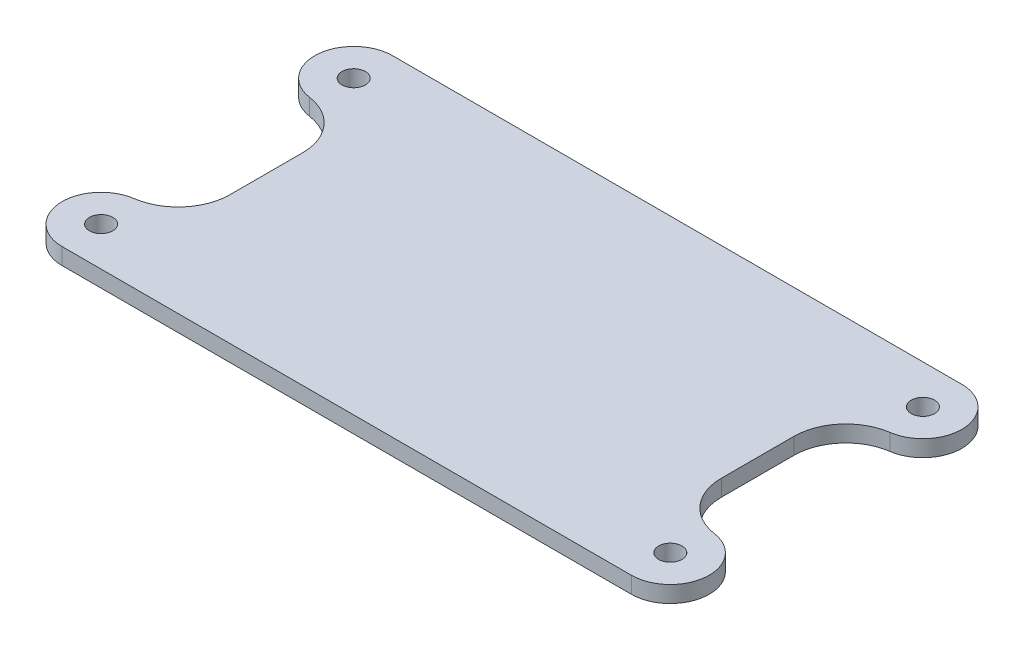
ISO-10303-21;
HEADER;
FILE_DESCRIPTION(('STEP AP214'),'2;1');
FILE_NAME('part.step','',(''),(''),'','','');
FILE_SCHEMA(('AUTOMOTIVE_DESIGN { 1 0 10303 214 1 1 1 1 }'));
ENDSEC;
DATA;
#1=APPLICATION_CONTEXT('core data for automotive mechanical design processes');
#2=APPLICATION_PROTOCOL_DEFINITION('international standard','automotive_design',2000,#1);
#3=PRODUCT_CONTEXT('',#1,'mechanical');
#4=PRODUCT('Part','Part','',(#3));
#5=PRODUCT_RELATED_PRODUCT_CATEGORY('part','',(#4));
#6=PRODUCT_DEFINITION_FORMATION('','',#4);
#7=PRODUCT_DEFINITION_CONTEXT('part definition',#1,'design');
#8=PRODUCT_DEFINITION('design','',#6,#7);
#9=PRODUCT_DEFINITION_SHAPE('','',#8);
#10=(LENGTH_UNIT() NAMED_UNIT(*) SI_UNIT(.MILLI.,.METRE.));
#11=(NAMED_UNIT(*) PLANE_ANGLE_UNIT() SI_UNIT($,.RADIAN.));
#12=(NAMED_UNIT(*) SI_UNIT($,.STERADIAN.) SOLID_ANGLE_UNIT());
#13=UNCERTAINTY_MEASURE_WITH_UNIT(LENGTH_MEASURE(1.E-05),#10,'distance_accuracy_value','');
#14=(GEOMETRIC_REPRESENTATION_CONTEXT(3) GLOBAL_UNCERTAINTY_ASSIGNED_CONTEXT((#13)) GLOBAL_UNIT_ASSIGNED_CONTEXT((#10,
#11,#12)) REPRESENTATION_CONTEXT('',''));
#15=CARTESIAN_POINT('',(0.,0.,0.));
#16=DIRECTION('',(0.,0.,1.));
#17=DIRECTION('',(1.,0.,0.));
#18=AXIS2_PLACEMENT_3D('',#15,#16,#17);
#19=CARTESIAN_POINT('',(-54.75,1.5875,-24.297));
#20=DIRECTION('',(0.,1.,0.));
#21=DIRECTION('',(0.,0.,1.));
#22=AXIS2_PLACEMENT_3D('',#19,#20,#21);
#23=PLANE('',#22);
#24=CARTESIAN_POINT('',(-54.75,1.5875,24.297));
#25=DIRECTION('',(0.,1.,0.));
#26=DIRECTION('',(0.,0.,1.));
#27=AXIS2_PLACEMENT_3D('',#24,#25,#26);
#28=CIRCLE('',#27,2.2479);
#29=CARTESIAN_POINT('',(-54.75,1.5875,26.5449));
#30=VERTEX_POINT('',#29);
#31=EDGE_CURVE('E444',#30,#30,#28,.T.);
#32=ORIENTED_EDGE('',*,*,#31,.F.);
#33=EDGE_LOOP('',(#32));
#34=FACE_BOUND('',#33,.T.);
#35=CARTESIAN_POINT('',(54.75,1.5875,-24.297));
#36=DIRECTION('',(0.,1.,0.));
#37=DIRECTION('',(0.,0.,1.));
#38=AXIS2_PLACEMENT_3D('',#35,#36,#37);
#39=CIRCLE('',#38,2.2479);
#40=CARTESIAN_POINT('',(54.75,1.5875,-22.0491));
#41=VERTEX_POINT('',#40);
#42=EDGE_CURVE('E166',#41,#41,#39,.T.);
#43=ORIENTED_EDGE('',*,*,#42,.F.);
#44=EDGE_LOOP('',(#43));
#45=FACE_BOUND('',#44,.T.);
#46=CARTESIAN_POINT('',(-54.75,1.5875,-24.297));
#47=DIRECTION('',(0.,1.,0.));
#48=DIRECTION('',(0.,0.,1.));
#49=AXIS2_PLACEMENT_3D('',#46,#47,#48);
#50=CIRCLE('',#49,7.5);
#51=CARTESIAN_POINT('',(-54.75,1.5875,-31.797));
#52=VERTEX_POINT('',#51);
#53=CARTESIAN_POINT('',(-55.8214285714286,1.5875,-16.8739251104191));
#54=VERTEX_POINT('',#53);
#55=EDGE_CURVE('E113',#52,#54,#50,.T.);
#56=ORIENTED_EDGE('',*,*,#55,.T.);
#57=CARTESIAN_POINT('',(-57.25,1.5875,-6.97649192431122));
#58=DIRECTION('',(0.,-1.,0.));
#59=DIRECTION('',(0.,0.,1.));
#60=AXIS2_PLACEMENT_3D('',#57,#58,#59);
#61=CIRCLE('',#60,10.);
#62=CARTESIAN_POINT('',(-47.25,1.5875,-6.97649192431122));
#63=VERTEX_POINT('',#62);
#64=EDGE_CURVE('E256',#54,#63,#61,.T.);
#65=ORIENTED_EDGE('',*,*,#64,.T.);
#66=DIRECTION('',(0.,0.,1.));
#67=VECTOR('',#66,1.);
#68=CARTESIAN_POINT('',(-47.25,1.5875,-6.97649192431122));
#69=LINE('',#68,#67);
#70=CARTESIAN_POINT('',(-47.25,1.5875,6.97649192431122));
#71=VERTEX_POINT('',#70);
#72=EDGE_CURVE('E216',#63,#71,#69,.T.);
#73=ORIENTED_EDGE('',*,*,#72,.T.);
#74=CARTESIAN_POINT('',(-57.25,1.5875,6.97649192431122));
#75=DIRECTION('',(0.,-1.,0.));
#76=DIRECTION('',(0.,0.,1.));
#77=AXIS2_PLACEMENT_3D('',#74,#75,#76);
#78=CIRCLE('',#77,10.);
#79=CARTESIAN_POINT('',(-55.8214285714286,1.5875,16.8739251104191));
#80=VERTEX_POINT('',#79);
#81=EDGE_CURVE('E234',#71,#80,#78,.T.);
#82=ORIENTED_EDGE('',*,*,#81,.T.);
#83=CARTESIAN_POINT('',(-54.75,1.5875,24.297));
#84=DIRECTION('',(0.,1.,0.));
#85=DIRECTION('',(0.,0.,1.));
#86=AXIS2_PLACEMENT_3D('',#83,#84,#85);
#87=CIRCLE('',#86,7.5);
#88=CARTESIAN_POINT('',(-54.75,1.5875,31.797));
#89=VERTEX_POINT('',#88);
#90=EDGE_CURVE('E231',#80,#89,#87,.T.);
#91=ORIENTED_EDGE('',*,*,#90,.T.);
#92=DIRECTION('',(1.,0.,0.));
#93=VECTOR('',#92,1.);
#94=CARTESIAN_POINT('',(-54.75,1.5875,31.797));
#95=LINE('',#94,#93);
#96=CARTESIAN_POINT('',(54.75,1.5875,31.797));
#97=VERTEX_POINT('',#96);
#98=EDGE_CURVE('E233',#89,#97,#95,.T.);
#99=ORIENTED_EDGE('',*,*,#98,.T.);
#100=CARTESIAN_POINT('',(54.75,1.5875,24.297));
#101=DIRECTION('',(0.,1.,0.));
#102=DIRECTION('',(0.,0.,1.));
#103=AXIS2_PLACEMENT_3D('',#100,#101,#102);
#104=CIRCLE('',#103,7.5);
#105=CARTESIAN_POINT('',(55.8214285714286,1.5875,16.8739251104191));
#106=VERTEX_POINT('',#105);
#107=EDGE_CURVE('E236',#97,#106,#104,.T.);
#108=ORIENTED_EDGE('',*,*,#107,.T.);
#109=CARTESIAN_POINT('',(57.25,1.5875,6.97649192431123));
#110=DIRECTION('',(0.,-1.,0.));
#111=DIRECTION('',(0.,0.,1.));
#112=AXIS2_PLACEMENT_3D('',#109,#110,#111);
#113=CIRCLE('',#112,10.);
#114=CARTESIAN_POINT('',(47.25,1.5875,6.97649192431123));
#115=VERTEX_POINT('',#114);
#116=EDGE_CURVE('E242',#106,#115,#113,.T.);
#117=ORIENTED_EDGE('',*,*,#116,.T.);
#118=DIRECTION('',(0.,0.,-1.));
#119=VECTOR('',#118,1.);
#120=CARTESIAN_POINT('',(47.25,1.5875,6.97649192431123));
#121=LINE('',#120,#119);
#122=CARTESIAN_POINT('',(47.25,1.5875,-6.97649192431123));
#123=VERTEX_POINT('',#122);
#124=EDGE_CURVE('E145',#115,#123,#121,.T.);
#125=ORIENTED_EDGE('',*,*,#124,.T.);
#126=CARTESIAN_POINT('',(57.25,1.5875,-6.97649192431123));
#127=DIRECTION('',(0.,-1.,0.));
#128=DIRECTION('',(0.,0.,1.));
#129=AXIS2_PLACEMENT_3D('',#126,#127,#128);
#130=CIRCLE('',#129,10.);
#131=CARTESIAN_POINT('',(55.8214285714286,1.5875,-16.8739251104191));
#132=VERTEX_POINT('',#131);
#133=EDGE_CURVE('E139',#123,#132,#130,.T.);
#134=ORIENTED_EDGE('',*,*,#133,.T.);
#135=CARTESIAN_POINT('',(54.75,1.5875,-24.297));
#136=DIRECTION('',(0.,1.,0.));
#137=DIRECTION('',(0.,0.,1.));
#138=AXIS2_PLACEMENT_3D('',#135,#136,#137);
#139=CIRCLE('',#138,7.5);
#140=CARTESIAN_POINT('',(54.75,1.5875,-31.797));
#141=VERTEX_POINT('',#140);
#142=EDGE_CURVE('E143',#132,#141,#139,.T.);
#143=ORIENTED_EDGE('',*,*,#142,.T.);
#144=DIRECTION('',(-1.,0.,0.));
#145=VECTOR('',#144,1.);
#146=CARTESIAN_POINT('',(54.75,1.5875,-31.797));
#147=LINE('',#146,#145);
#148=EDGE_CURVE('E60',#141,#52,#147,.T.);
#149=ORIENTED_EDGE('',*,*,#148,.T.);
#150=EDGE_LOOP('',(#56,#65,#73,#82,#91,#99,#108,#117,#125,#134,#143,#149));
#151=FACE_BOUND('',#150,.T.);
#152=CARTESIAN_POINT('',(54.75,1.5875,24.297));
#153=DIRECTION('',(0.,1.,0.));
#154=DIRECTION('',(0.,0.,1.));
#155=AXIS2_PLACEMENT_3D('',#152,#153,#154);
#156=CIRCLE('',#155,2.2479);
#157=CARTESIAN_POINT('',(54.75,1.5875,26.5449));
#158=VERTEX_POINT('',#157);
#159=EDGE_CURVE('E450',#158,#158,#156,.T.);
#160=ORIENTED_EDGE('',*,*,#159,.F.);
#161=EDGE_LOOP('',(#160));
#162=FACE_BOUND('',#161,.T.);
#163=CARTESIAN_POINT('',(-54.75,1.5875,-24.297));
#164=DIRECTION('',(0.,1.,0.));
#165=DIRECTION('',(0.,0.,1.));
#166=AXIS2_PLACEMENT_3D('',#163,#164,#165);
#167=CIRCLE('',#166,2.2479);
#168=CARTESIAN_POINT('',(-54.75,1.5875,-22.0491));
#169=VERTEX_POINT('',#168);
#170=EDGE_CURVE('E435',#169,#169,#167,.T.);
#171=ORIENTED_EDGE('',*,*,#170,.F.);
#172=EDGE_LOOP('',(#171));
#173=FACE_BOUND('',#172,.T.);
#174=ADVANCED_FACE('F43',(#34,#45,#151,#162,#173),#23,.T.);
#175=CARTESIAN_POINT('',(-54.75,-1.5875,-24.297));
#176=DIRECTION('',(0.,1.,0.));
#177=DIRECTION('',(0.,0.,1.));
#178=AXIS2_PLACEMENT_3D('',#175,#176,#177);
#179=PLANE('',#178);
#180=CARTESIAN_POINT('',(-54.75,-1.5875,-24.297));
#181=DIRECTION('',(0.,1.,0.));
#182=DIRECTION('',(0.,0.,1.));
#183=AXIS2_PLACEMENT_3D('',#180,#181,#182);
#184=CIRCLE('',#183,7.5);
#185=CARTESIAN_POINT('',(-54.75,-1.5875,-31.797));
#186=VERTEX_POINT('',#185);
#187=CARTESIAN_POINT('',(-55.8214285714286,-1.5875,-16.8739251104191));
#188=VERTEX_POINT('',#187);
#189=EDGE_CURVE('E107',#186,#188,#184,.T.);
#190=ORIENTED_EDGE('',*,*,#189,.F.);
#191=DIRECTION('',(-1.,0.,0.));
#192=VECTOR('',#191,1.);
#193=CARTESIAN_POINT('',(54.75,-1.5875,-31.797));
#194=LINE('',#193,#192);
#195=CARTESIAN_POINT('',(54.75,-1.5875,-31.797));
#196=VERTEX_POINT('',#195);
#197=EDGE_CURVE('E186',#196,#186,#194,.T.);
#198=ORIENTED_EDGE('',*,*,#197,.F.);
#199=CARTESIAN_POINT('',(54.75,-1.5875,-24.297));
#200=DIRECTION('',(0.,1.,0.));
#201=DIRECTION('',(0.,0.,1.));
#202=AXIS2_PLACEMENT_3D('',#199,#200,#201);
#203=CIRCLE('',#202,7.5);
#204=CARTESIAN_POINT('',(55.8214285714286,-1.5875,-16.8739251104191));
#205=VERTEX_POINT('',#204);
#206=EDGE_CURVE('E100',#205,#196,#203,.T.);
#207=ORIENTED_EDGE('',*,*,#206,.F.);
#208=CARTESIAN_POINT('',(57.25,-1.5875,-6.97649192431123));
#209=DIRECTION('',(0.,-1.,0.));
#210=DIRECTION('',(0.,0.,1.));
#211=AXIS2_PLACEMENT_3D('',#208,#209,#210);
#212=CIRCLE('',#211,10.);
#213=CARTESIAN_POINT('',(47.25,-1.5875,-6.97649192431123));
#214=VERTEX_POINT('',#213);
#215=EDGE_CURVE('E154',#214,#205,#212,.T.);
#216=ORIENTED_EDGE('',*,*,#215,.F.);
#217=DIRECTION('',(0.,0.,-1.));
#218=VECTOR('',#217,1.);
#219=CARTESIAN_POINT('',(47.25,-1.5875,6.97649192431123));
#220=LINE('',#219,#218);
#221=CARTESIAN_POINT('',(47.25,-1.5875,6.97649192431123));
#222=VERTEX_POINT('',#221);
#223=EDGE_CURVE('E182',#222,#214,#220,.T.);
#224=ORIENTED_EDGE('',*,*,#223,.F.);
#225=CARTESIAN_POINT('',(57.25,-1.5875,6.97649192431123));
#226=DIRECTION('',(0.,-1.,0.));
#227=DIRECTION('',(0.,0.,1.));
#228=AXIS2_PLACEMENT_3D('',#225,#226,#227);
#229=CIRCLE('',#228,10.);
#230=CARTESIAN_POINT('',(55.8214285714286,-1.5875,16.8739251104191));
#231=VERTEX_POINT('',#230);
#232=EDGE_CURVE('E180',#231,#222,#229,.T.);
#233=ORIENTED_EDGE('',*,*,#232,.F.);
#234=CARTESIAN_POINT('',(54.75,-1.5875,24.297));
#235=DIRECTION('',(0.,1.,0.));
#236=DIRECTION('',(0.,0.,1.));
#237=AXIS2_PLACEMENT_3D('',#234,#235,#236);
#238=CIRCLE('',#237,7.5);
#239=CARTESIAN_POINT('',(54.75,-1.5875,31.797));
#240=VERTEX_POINT('',#239);
#241=EDGE_CURVE('E178',#240,#231,#238,.T.);
#242=ORIENTED_EDGE('',*,*,#241,.F.);
#243=DIRECTION('',(1.,0.,0.));
#244=VECTOR('',#243,1.);
#245=CARTESIAN_POINT('',(-54.75,-1.5875,31.797));
#246=LINE('',#245,#244);
#247=CARTESIAN_POINT('',(-54.75,-1.5875,31.797));
#248=VERTEX_POINT('',#247);
#249=EDGE_CURVE('E175',#248,#240,#246,.T.);
#250=ORIENTED_EDGE('',*,*,#249,.F.);
#251=CARTESIAN_POINT('',(-54.75,-1.5875,24.297));
#252=DIRECTION('',(0.,1.,0.));
#253=DIRECTION('',(0.,0.,1.));
#254=AXIS2_PLACEMENT_3D('',#251,#252,#253);
#255=CIRCLE('',#254,7.5);
#256=CARTESIAN_POINT('',(-55.8214285714286,-1.5875,16.8739251104191));
#257=VERTEX_POINT('',#256);
#258=EDGE_CURVE('E173',#257,#248,#255,.T.);
#259=ORIENTED_EDGE('',*,*,#258,.F.);
#260=CARTESIAN_POINT('',(-57.25,-1.5875,6.97649192431122));
#261=DIRECTION('',(0.,-1.,0.));
#262=DIRECTION('',(0.,0.,1.));
#263=AXIS2_PLACEMENT_3D('',#260,#261,#262);
#264=CIRCLE('',#263,10.);
#265=CARTESIAN_POINT('',(-47.25,-1.5875,6.97649192431122));
#266=VERTEX_POINT('',#265);
#267=EDGE_CURVE('E170',#266,#257,#264,.T.);
#268=ORIENTED_EDGE('',*,*,#267,.F.);
#269=DIRECTION('',(0.,0.,1.));
#270=VECTOR('',#269,1.);
#271=CARTESIAN_POINT('',(-47.25,-1.5875,-6.97649192431122));
#272=LINE('',#271,#270);
#273=CARTESIAN_POINT('',(-47.25,-1.5875,-6.97649192431122));
#274=VERTEX_POINT('',#273);
#275=EDGE_CURVE('E168',#274,#266,#272,.T.);
#276=ORIENTED_EDGE('',*,*,#275,.F.);
#277=CARTESIAN_POINT('',(-57.25,-1.5875,-6.97649192431122));
#278=DIRECTION('',(0.,-1.,0.));
#279=DIRECTION('',(0.,0.,1.));
#280=AXIS2_PLACEMENT_3D('',#277,#278,#279);
#281=CIRCLE('',#280,10.);
#282=EDGE_CURVE('E165',#188,#274,#281,.T.);
#283=ORIENTED_EDGE('',*,*,#282,.F.);
#284=EDGE_LOOP('',(#190,#198,#207,#216,#224,#233,#242,#250,#259,#268,#276,#283));
#285=FACE_BOUND('',#284,.T.);
#286=CARTESIAN_POINT('',(54.75,-1.5875,-24.297));
#287=DIRECTION('',(0.,1.,0.));
#288=DIRECTION('',(0.,0.,1.));
#289=AXIS2_PLACEMENT_3D('',#286,#287,#288);
#290=CIRCLE('',#289,2.2479);
#291=CARTESIAN_POINT('',(54.75,-1.5875,-22.0491));
#292=VERTEX_POINT('',#291);
#293=EDGE_CURVE('E260',#292,#292,#290,.T.);
#294=ORIENTED_EDGE('',*,*,#293,.T.);
#295=EDGE_LOOP('',(#294));
#296=FACE_BOUND('',#295,.T.);
#297=CARTESIAN_POINT('',(54.75,-1.5875,24.297));
#298=DIRECTION('',(0.,1.,0.));
#299=DIRECTION('',(0.,0.,1.));
#300=AXIS2_PLACEMENT_3D('',#297,#298,#299);
#301=CIRCLE('',#300,2.2479);
#302=CARTESIAN_POINT('',(54.75,-1.5875,26.5449));
#303=VERTEX_POINT('',#302);
#304=EDGE_CURVE('E447',#303,#303,#301,.T.);
#305=ORIENTED_EDGE('',*,*,#304,.T.);
#306=EDGE_LOOP('',(#305));
#307=FACE_BOUND('',#306,.T.);
#308=CARTESIAN_POINT('',(-54.75,-1.5875,24.297));
#309=DIRECTION('',(0.,1.,0.));
#310=DIRECTION('',(0.,0.,1.));
#311=AXIS2_PLACEMENT_3D('',#308,#309,#310);
#312=CIRCLE('',#311,2.2479);
#313=CARTESIAN_POINT('',(-54.75,-1.5875,26.5449));
#314=VERTEX_POINT('',#313);
#315=EDGE_CURVE('E441',#314,#314,#312,.T.);
#316=ORIENTED_EDGE('',*,*,#315,.T.);
#317=EDGE_LOOP('',(#316));
#318=FACE_BOUND('',#317,.T.);
#319=CARTESIAN_POINT('',(-54.75,-1.5875,-24.297));
#320=DIRECTION('',(0.,1.,0.));
#321=DIRECTION('',(0.,0.,1.));
#322=AXIS2_PLACEMENT_3D('',#319,#320,#321);
#323=CIRCLE('',#322,2.2479);
#324=CARTESIAN_POINT('',(-54.75,-1.5875,-22.0491));
#325=VERTEX_POINT('',#324);
#326=EDGE_CURVE('E438',#325,#325,#323,.T.);
#327=ORIENTED_EDGE('',*,*,#326,.T.);
#328=EDGE_LOOP('',(#327));
#329=FACE_BOUND('',#328,.T.);
#330=ADVANCED_FACE('F220',(#285,#296,#307,#318,#329),#179,.F.);
#331=CARTESIAN_POINT('',(-54.75,1.5875,-24.297));
#332=DIRECTION('',(0.,-1.,0.));
#333=DIRECTION('',(0.,0.,-1.));
#334=AXIS2_PLACEMENT_3D('',#331,#332,#333);
#335=CYLINDRICAL_SURFACE('',#334,7.5);
#336=ORIENTED_EDGE('',*,*,#189,.T.);
#337=DIRECTION('',(0.,-1.,0.));
#338=VECTOR('',#337,1.);
#339=CARTESIAN_POINT('',(-55.8214285714286,1.5875,-16.8739251104191));
#340=LINE('',#339,#338);
#341=EDGE_CURVE('E11',#54,#188,#340,.T.);
#342=ORIENTED_EDGE('',*,*,#341,.F.);
#343=ORIENTED_EDGE('',*,*,#55,.F.);
#344=DIRECTION('',(0.,-1.,0.));
#345=VECTOR('',#344,1.);
#346=CARTESIAN_POINT('',(-54.75,1.5875,-31.797));
#347=LINE('',#346,#345);
#348=EDGE_CURVE('E160',#52,#186,#347,.T.);
#349=ORIENTED_EDGE('',*,*,#348,.T.);
#350=EDGE_LOOP('',(#336,#342,#343,#349));
#351=FACE_BOUND('',#350,.T.);
#352=ADVANCED_FACE('F45',(#351),#335,.T.);
#353=CARTESIAN_POINT('',(-57.25,1.5875,-6.97649192431122));
#354=DIRECTION('',(0.,-1.,0.));
#355=DIRECTION('',(0.,0.,-1.));
#356=AXIS2_PLACEMENT_3D('',#353,#354,#355);
#357=CYLINDRICAL_SURFACE('',#356,10.);
#358=ORIENTED_EDGE('',*,*,#282,.T.);
#359=DIRECTION('',(0.,-1.,0.));
#360=VECTOR('',#359,1.);
#361=CARTESIAN_POINT('',(-47.25,1.5875,-6.97649192431122));
#362=LINE('',#361,#360);
#363=EDGE_CURVE('E52',#63,#274,#362,.T.);
#364=ORIENTED_EDGE('',*,*,#363,.F.);
#365=ORIENTED_EDGE('',*,*,#64,.F.);
#366=ORIENTED_EDGE('',*,*,#341,.T.);
#367=EDGE_LOOP('',(#358,#364,#365,#366));
#368=FACE_BOUND('',#367,.T.);
#369=ADVANCED_FACE('F262',(#368),#357,.F.);
#370=CARTESIAN_POINT('',(-47.25,1.5875,-6.97649192431122));
#371=DIRECTION('',(1.,0.,0.));
#372=DIRECTION('',(0.,0.,-1.));
#373=AXIS2_PLACEMENT_3D('',#370,#371,#372);
#374=PLANE('',#373);
#375=ORIENTED_EDGE('',*,*,#275,.T.);
#376=DIRECTION('',(0.,-1.,0.));
#377=VECTOR('',#376,1.);
#378=CARTESIAN_POINT('',(-47.25,1.5875,6.97649192431122));
#379=LINE('',#378,#377);
#380=EDGE_CURVE('E207',#71,#266,#379,.T.);
#381=ORIENTED_EDGE('',*,*,#380,.F.);
#382=ORIENTED_EDGE('',*,*,#72,.F.);
#383=ORIENTED_EDGE('',*,*,#363,.T.);
#384=EDGE_LOOP('',(#375,#381,#382,#383));
#385=FACE_BOUND('',#384,.T.);
#386=ADVANCED_FACE('F214',(#385),#374,.F.);
#387=CARTESIAN_POINT('',(-57.25,1.5875,6.97649192431122));
#388=DIRECTION('',(0.,-1.,0.));
#389=DIRECTION('',(0.,0.,-1.));
#390=AXIS2_PLACEMENT_3D('',#387,#388,#389);
#391=CYLINDRICAL_SURFACE('',#390,10.);
#392=ORIENTED_EDGE('',*,*,#267,.T.);
#393=DIRECTION('',(0.,-1.,0.));
#394=VECTOR('',#393,1.);
#395=CARTESIAN_POINT('',(-55.8214285714286,1.5875,16.8739251104191));
#396=LINE('',#395,#394);
#397=EDGE_CURVE('E204',#80,#257,#396,.T.);
#398=ORIENTED_EDGE('',*,*,#397,.F.);
#399=ORIENTED_EDGE('',*,*,#81,.F.);
#400=ORIENTED_EDGE('',*,*,#380,.T.);
#401=EDGE_LOOP('',(#392,#398,#399,#400));
#402=FACE_BOUND('',#401,.T.);
#403=ADVANCED_FACE('F225',(#402),#391,.F.);
#404=CARTESIAN_POINT('',(-54.75,1.5875,24.297));
#405=DIRECTION('',(0.,-1.,0.));
#406=DIRECTION('',(0.,0.,-1.));
#407=AXIS2_PLACEMENT_3D('',#404,#405,#406);
#408=CYLINDRICAL_SURFACE('',#407,7.5);
#409=ORIENTED_EDGE('',*,*,#258,.T.);
#410=DIRECTION('',(0.,-1.,0.));
#411=VECTOR('',#410,1.);
#412=CARTESIAN_POINT('',(-54.75,1.5875,31.797));
#413=LINE('',#412,#411);
#414=EDGE_CURVE('E201',#89,#248,#413,.T.);
#415=ORIENTED_EDGE('',*,*,#414,.F.);
#416=ORIENTED_EDGE('',*,*,#90,.F.);
#417=ORIENTED_EDGE('',*,*,#397,.T.);
#418=EDGE_LOOP('',(#409,#415,#416,#417));
#419=FACE_BOUND('',#418,.T.);
#420=ADVANCED_FACE('F229',(#419),#408,.T.);
#421=CARTESIAN_POINT('',(-54.75,1.5875,31.797));
#422=DIRECTION('',(0.,0.,-1.));
#423=DIRECTION('',(-1.,0.,0.));
#424=AXIS2_PLACEMENT_3D('',#421,#422,#423);
#425=PLANE('',#424);
#426=ORIENTED_EDGE('',*,*,#249,.T.);
#427=DIRECTION('',(0.,-1.,0.));
#428=VECTOR('',#427,1.);
#429=CARTESIAN_POINT('',(54.75,1.5875,31.797));
#430=LINE('',#429,#428);
#431=EDGE_CURVE('E198',#97,#240,#430,.T.);
#432=ORIENTED_EDGE('',*,*,#431,.F.);
#433=ORIENTED_EDGE('',*,*,#98,.F.);
#434=ORIENTED_EDGE('',*,*,#414,.T.);
#435=EDGE_LOOP('',(#426,#432,#433,#434));
#436=FACE_BOUND('',#435,.T.);
#437=ADVANCED_FACE('F295',(#436),#425,.F.);
#438=CARTESIAN_POINT('',(54.75,1.5875,24.297));
#439=DIRECTION('',(0.,-1.,0.));
#440=DIRECTION('',(0.,0.,-1.));
#441=AXIS2_PLACEMENT_3D('',#438,#439,#440);
#442=CYLINDRICAL_SURFACE('',#441,7.5);
#443=ORIENTED_EDGE('',*,*,#241,.T.);
#444=DIRECTION('',(0.,-1.,0.));
#445=VECTOR('',#444,1.);
#446=CARTESIAN_POINT('',(55.8214285714286,1.5875,16.8739251104191));
#447=LINE('',#446,#445);
#448=EDGE_CURVE('E195',#106,#231,#447,.T.);
#449=ORIENTED_EDGE('',*,*,#448,.F.);
#450=ORIENTED_EDGE('',*,*,#107,.F.);
#451=ORIENTED_EDGE('',*,*,#431,.T.);
#452=EDGE_LOOP('',(#443,#449,#450,#451));
#453=FACE_BOUND('',#452,.T.);
#454=ADVANCED_FACE('F292',(#453),#442,.T.);
#455=CARTESIAN_POINT('',(57.25,1.5875,6.97649192431123));
#456=DIRECTION('',(0.,-1.,0.));
#457=DIRECTION('',(0.,0.,-1.));
#458=AXIS2_PLACEMENT_3D('',#455,#456,#457);
#459=CYLINDRICAL_SURFACE('',#458,10.);
#460=ORIENTED_EDGE('',*,*,#232,.T.);
#461=DIRECTION('',(0.,-1.,0.));
#462=VECTOR('',#461,1.);
#463=CARTESIAN_POINT('',(47.25,1.5875,6.97649192431123));
#464=LINE('',#463,#462);
#465=EDGE_CURVE('E192',#115,#222,#464,.T.);
#466=ORIENTED_EDGE('',*,*,#465,.F.);
#467=ORIENTED_EDGE('',*,*,#116,.F.);
#468=ORIENTED_EDGE('',*,*,#448,.T.);
#469=EDGE_LOOP('',(#460,#466,#467,#468));
#470=FACE_BOUND('',#469,.T.);
#471=ADVANCED_FACE('F248',(#470),#459,.F.);
#472=CARTESIAN_POINT('',(47.25,1.5875,6.97649192431123));
#473=DIRECTION('',(-1.,0.,0.));
#474=DIRECTION('',(0.,0.,1.));
#475=AXIS2_PLACEMENT_3D('',#472,#473,#474);
#476=PLANE('',#475);
#477=ORIENTED_EDGE('',*,*,#223,.T.);
#478=DIRECTION('',(0.,-1.,0.));
#479=VECTOR('',#478,1.);
#480=CARTESIAN_POINT('',(47.25,1.5875,-6.97649192431123));
#481=LINE('',#480,#479);
#482=EDGE_CURVE('E155',#123,#214,#481,.T.);
#483=ORIENTED_EDGE('',*,*,#482,.F.);
#484=ORIENTED_EDGE('',*,*,#124,.F.);
#485=ORIENTED_EDGE('',*,*,#465,.T.);
#486=EDGE_LOOP('',(#477,#483,#484,#485));
#487=FACE_BOUND('',#486,.T.);
#488=ADVANCED_FACE('F252',(#487),#476,.F.);
#489=CARTESIAN_POINT('',(57.25,1.5875,-6.97649192431123));
#490=DIRECTION('',(0.,-1.,0.));
#491=DIRECTION('',(0.,0.,-1.));
#492=AXIS2_PLACEMENT_3D('',#489,#490,#491);
#493=CYLINDRICAL_SURFACE('',#492,10.);
#494=ORIENTED_EDGE('',*,*,#215,.T.);
#495=DIRECTION('',(0.,-1.,0.));
#496=VECTOR('',#495,1.);
#497=CARTESIAN_POINT('',(55.8214285714286,1.5875,-16.8739251104191));
#498=LINE('',#497,#496);
#499=EDGE_CURVE('E151',#132,#205,#498,.T.);
#500=ORIENTED_EDGE('',*,*,#499,.F.);
#501=ORIENTED_EDGE('',*,*,#133,.F.);
#502=ORIENTED_EDGE('',*,*,#482,.T.);
#503=EDGE_LOOP('',(#494,#500,#501,#502));
#504=FACE_BOUND('',#503,.T.);
#505=ADVANCED_FACE('F152',(#504),#493,.F.);
#506=CARTESIAN_POINT('',(54.75,1.5875,-24.297));
#507=DIRECTION('',(0.,-1.,0.));
#508=DIRECTION('',(0.,0.,-1.));
#509=AXIS2_PLACEMENT_3D('',#506,#507,#508);
#510=CYLINDRICAL_SURFACE('',#509,7.5);
#511=ORIENTED_EDGE('',*,*,#206,.T.);
#512=DIRECTION('',(0.,-1.,0.));
#513=VECTOR('',#512,1.);
#514=CARTESIAN_POINT('',(54.75,1.5875,-31.797));
#515=LINE('',#514,#513);
#516=EDGE_CURVE('E156',#141,#196,#515,.T.);
#517=ORIENTED_EDGE('',*,*,#516,.F.);
#518=ORIENTED_EDGE('',*,*,#142,.F.);
#519=ORIENTED_EDGE('',*,*,#499,.T.);
#520=EDGE_LOOP('',(#511,#517,#518,#519));
#521=FACE_BOUND('',#520,.T.);
#522=ADVANCED_FACE('F158',(#521),#510,.T.);
#523=CARTESIAN_POINT('',(54.75,1.5875,-31.797));
#524=DIRECTION('',(0.,0.,1.));
#525=DIRECTION('',(1.,0.,0.));
#526=AXIS2_PLACEMENT_3D('',#523,#524,#525);
#527=PLANE('',#526);
#528=ORIENTED_EDGE('',*,*,#197,.T.);
#529=ORIENTED_EDGE('',*,*,#348,.F.);
#530=ORIENTED_EDGE('',*,*,#148,.F.);
#531=ORIENTED_EDGE('',*,*,#516,.T.);
#532=EDGE_LOOP('',(#528,#529,#530,#531));
#533=FACE_BOUND('',#532,.T.);
#534=ADVANCED_FACE('F254',(#533),#527,.F.);
#535=CARTESIAN_POINT('',(54.75,1.5875,-24.297));
#536=DIRECTION('',(0.,-1.,0.));
#537=DIRECTION('',(0.,0.,-1.));
#538=AXIS2_PLACEMENT_3D('',#535,#536,#537);
#539=CYLINDRICAL_SURFACE('',#538,2.2479);
#540=ORIENTED_EDGE('',*,*,#42,.T.);
#541=EDGE_LOOP('',(#540));
#542=FACE_BOUND('',#541,.T.);
#543=ORIENTED_EDGE('',*,*,#293,.F.);
#544=EDGE_LOOP('',(#543));
#545=FACE_BOUND('',#544,.T.);
#546=ADVANCED_FACE('F279',(#542,#545),#539,.F.);
#547=CARTESIAN_POINT('',(54.75,1.5875,24.297));
#548=DIRECTION('',(0.,-1.,0.));
#549=DIRECTION('',(0.,0.,-1.));
#550=AXIS2_PLACEMENT_3D('',#547,#548,#549);
#551=CYLINDRICAL_SURFACE('',#550,2.2479);
#552=ORIENTED_EDGE('',*,*,#159,.T.);
#553=EDGE_LOOP('',(#552));
#554=FACE_BOUND('',#553,.T.);
#555=ORIENTED_EDGE('',*,*,#304,.F.);
#556=EDGE_LOOP('',(#555));
#557=FACE_BOUND('',#556,.T.);
#558=ADVANCED_FACE('F354',(#554,#557),#551,.F.);
#559=CARTESIAN_POINT('',(-54.75,1.5875,24.297));
#560=DIRECTION('',(0.,-1.,0.));
#561=DIRECTION('',(0.,0.,-1.));
#562=AXIS2_PLACEMENT_3D('',#559,#560,#561);
#563=CYLINDRICAL_SURFACE('',#562,2.2479);
#564=ORIENTED_EDGE('',*,*,#31,.T.);
#565=EDGE_LOOP('',(#564));
#566=FACE_BOUND('',#565,.T.);
#567=ORIENTED_EDGE('',*,*,#315,.F.);
#568=EDGE_LOOP('',(#567));
#569=FACE_BOUND('',#568,.T.);
#570=ADVANCED_FACE('F362',(#566,#569),#563,.F.);
#571=CARTESIAN_POINT('',(-54.75,1.5875,-24.297));
#572=DIRECTION('',(0.,-1.,0.));
#573=DIRECTION('',(0.,0.,-1.));
#574=AXIS2_PLACEMENT_3D('',#571,#572,#573);
#575=CYLINDRICAL_SURFACE('',#574,2.2479);
#576=ORIENTED_EDGE('',*,*,#170,.T.);
#577=EDGE_LOOP('',(#576));
#578=FACE_BOUND('',#577,.T.);
#579=ORIENTED_EDGE('',*,*,#326,.F.);
#580=EDGE_LOOP('',(#579));
#581=FACE_BOUND('',#580,.T.);
#582=ADVANCED_FACE('F370',(#578,#581),#575,.F.);
#583=CLOSED_SHELL('',(#174,#330,#352,#369,#386,#403,#420,#437,#454,#471,#488,#505,#522,#534,
#546,#558,#570,#582));
#584=MANIFOLD_SOLID_BREP('B2',#583);
#585=ADVANCED_BREP_SHAPE_REPRESENTATION('',(#18,#584),#14);
#586=SHAPE_DEFINITION_REPRESENTATION(#9,#585);
ENDSEC;
END-ISO-10303-21;
